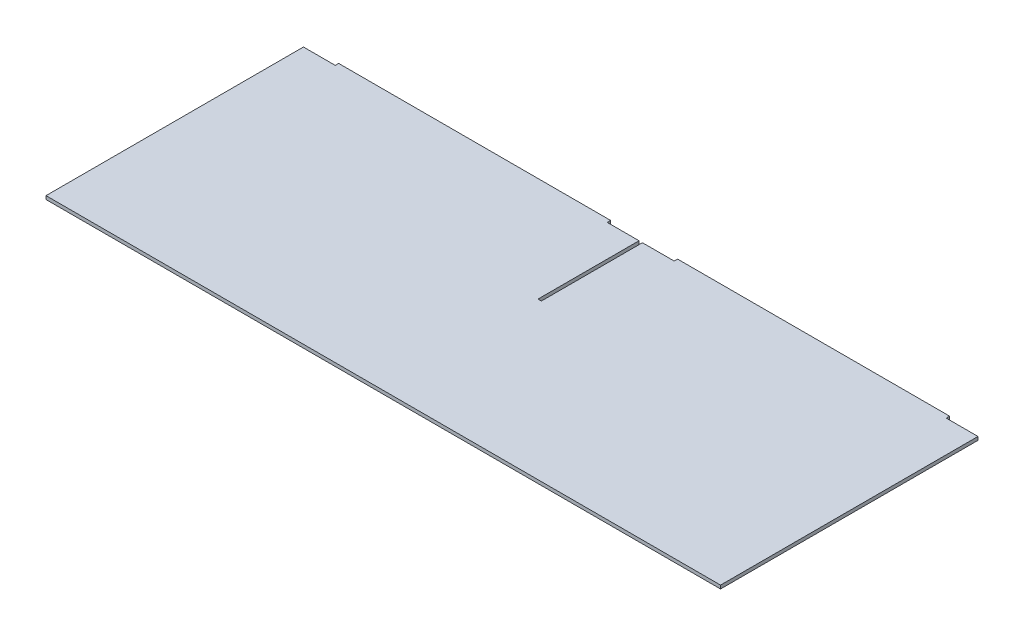
ISO-10303-21;
HEADER;
FILE_DESCRIPTION(('STEP AP214'),'2;1');
FILE_NAME('part.step','',(''),(''),'','','');
FILE_SCHEMA(('AUTOMOTIVE_DESIGN { 1 0 10303 214 1 1 1 1 }'));
ENDSEC;
DATA;
#1=APPLICATION_CONTEXT('core data for automotive mechanical design processes');
#2=APPLICATION_PROTOCOL_DEFINITION('international standard','automotive_design',2000,#1);
#3=PRODUCT_CONTEXT('',#1,'mechanical');
#4=PRODUCT('Part','Part','',(#3));
#5=PRODUCT_RELATED_PRODUCT_CATEGORY('part','',(#4));
#6=PRODUCT_DEFINITION_FORMATION('','',#4);
#7=PRODUCT_DEFINITION_CONTEXT('part definition',#1,'design');
#8=PRODUCT_DEFINITION('design','',#6,#7);
#9=PRODUCT_DEFINITION_SHAPE('','',#8);
#10=(LENGTH_UNIT() NAMED_UNIT(*) SI_UNIT(.MILLI.,.METRE.));
#11=(NAMED_UNIT(*) PLANE_ANGLE_UNIT() SI_UNIT($,.RADIAN.));
#12=(NAMED_UNIT(*) SI_UNIT($,.STERADIAN.) SOLID_ANGLE_UNIT());
#13=UNCERTAINTY_MEASURE_WITH_UNIT(LENGTH_MEASURE(1.E-05),#10,'distance_accuracy_value','');
#14=(GEOMETRIC_REPRESENTATION_CONTEXT(3) GLOBAL_UNCERTAINTY_ASSIGNED_CONTEXT((#13)) GLOBAL_UNIT_ASSIGNED_CONTEXT((#10,
#11,#12)) REPRESENTATION_CONTEXT('',''));
#15=CARTESIAN_POINT('',(0.,0.,0.));
#16=DIRECTION('',(0.,0.,1.));
#17=DIRECTION('',(1.,0.,0.));
#18=AXIS2_PLACEMENT_3D('',#15,#16,#17);
#19=CARTESIAN_POINT('',(0.,3.175,-147.69846));
#20=DIRECTION('',(0.,0.,1.));
#21=DIRECTION('',(1.,0.,0.));
#22=AXIS2_PLACEMENT_3D('',#19,#20,#21);
#23=PLANE('',#22);
#24=DIRECTION('',(-1.,0.,0.));
#25=VECTOR('',#24,1.);
#26=CARTESIAN_POINT('',(0.,0.,-147.69846));
#27=LINE('',#26,#25);
#28=CARTESIAN_POINT('',(346.22613,0.,-147.69846));
#29=VERTEX_POINT('',#28);
#30=CARTESIAN_POINT('',(316.54242,0.,-147.69846));
#31=VERTEX_POINT('',#30);
#32=EDGE_CURVE('E307',#29,#31,#27,.T.);
#33=ORIENTED_EDGE('',*,*,#32,.T.);
#34=DIRECTION('',(0.,1.,0.));
#35=VECTOR('',#34,1.);
#36=CARTESIAN_POINT('',(316.54242,3.175,-147.69846));
#37=LINE('',#36,#35);
#38=CARTESIAN_POINT('',(316.54242,3.175,-147.69846));
#39=VERTEX_POINT('',#38);
#40=EDGE_CURVE('E213',#31,#39,#37,.T.);
#41=ORIENTED_EDGE('',*,*,#40,.T.);
#42=DIRECTION('',(-1.,0.,0.));
#43=VECTOR('',#42,1.);
#44=CARTESIAN_POINT('',(0.,3.175,-147.69846));
#45=LINE('',#44,#43);
#46=CARTESIAN_POINT('',(346.22613,3.17499999999993,-147.69846));
#47=VERTEX_POINT('',#46);
#48=EDGE_CURVE('E299',#47,#39,#45,.T.);
#49=ORIENTED_EDGE('',*,*,#48,.F.);
#50=DIRECTION('',(0.,1.,0.));
#51=VECTOR('',#50,1.);
#52=CARTESIAN_POINT('',(346.22613,0.,-147.69846));
#53=LINE('',#52,#51);
#54=EDGE_CURVE('E259',#29,#47,#53,.T.);
#55=ORIENTED_EDGE('',*,*,#54,.F.);
#56=EDGE_LOOP('',(#33,#41,#49,#55));
#57=FACE_BOUND('',#56,.T.);
#58=ADVANCED_FACE('F39',(#57),#23,.F.);
#59=CARTESIAN_POINT('',(313.36742,3.175,-147.69846));
#60=VERTEX_POINT('',#59);
#61=CARTESIAN_POINT('',(283.68371,3.175,-147.69846));
#62=VERTEX_POINT('',#61);
#63=EDGE_CURVE('E300',#60,#62,#45,.T.);
#64=ORIENTED_EDGE('',*,*,#63,.F.);
#65=DIRECTION('',(0.,-1.,0.));
#66=VECTOR('',#65,1.);
#67=CARTESIAN_POINT('',(313.36742,3.175,-147.69846));
#68=LINE('',#67,#66);
#69=CARTESIAN_POINT('',(313.36742,0.,-147.69846));
#70=VERTEX_POINT('',#69);
#71=EDGE_CURVE('E207',#60,#70,#68,.T.);
#72=ORIENTED_EDGE('',*,*,#71,.T.);
#73=CARTESIAN_POINT('',(283.68371,0.,-147.69846));
#74=VERTEX_POINT('',#73);
#75=EDGE_CURVE('E308',#70,#74,#27,.T.);
#76=ORIENTED_EDGE('',*,*,#75,.T.);
#77=DIRECTION('',(0.,-1.,0.));
#78=VECTOR('',#77,1.);
#79=CARTESIAN_POINT('',(283.68371,0.,-147.69846));
#80=LINE('',#79,#78);
#81=EDGE_CURVE('E217',#62,#74,#80,.T.);
#82=ORIENTED_EDGE('',*,*,#81,.F.);
#83=EDGE_LOOP('',(#64,#72,#76,#82));
#84=FACE_BOUND('',#83,.T.);
#85=ADVANCED_FACE('F336',(#84),#23,.F.);
#86=DIRECTION('',(0.,1.,0.));
#87=VECTOR('',#86,1.);
#88=CARTESIAN_POINT('',(29.6837100000001,0.,-147.69846));
#89=LINE('',#88,#87);
#90=CARTESIAN_POINT('',(29.6837100000001,0.,-147.69846));
#91=VERTEX_POINT('',#90);
#92=CARTESIAN_POINT('',(29.6837100000001,3.175,-147.69846));
#93=VERTEX_POINT('',#92);
#94=EDGE_CURVE('E223',#91,#93,#89,.T.);
#95=ORIENTED_EDGE('',*,*,#94,.F.);
#96=CARTESIAN_POINT('',(0.,0.,-147.69846));
#97=VERTEX_POINT('',#96);
#98=EDGE_CURVE('E304',#91,#97,#27,.T.);
#99=ORIENTED_EDGE('',*,*,#98,.T.);
#100=DIRECTION('',(0.,-1.,0.));
#101=VECTOR('',#100,1.);
#102=CARTESIAN_POINT('',(0.,3.175,-147.69846));
#103=LINE('',#102,#101);
#104=CARTESIAN_POINT('',(0.,3.175,-147.69846));
#105=VERTEX_POINT('',#104);
#106=EDGE_CURVE('E160',#105,#97,#103,.T.);
#107=ORIENTED_EDGE('',*,*,#106,.F.);
#108=EDGE_CURVE('E63',#93,#105,#45,.T.);
#109=ORIENTED_EDGE('',*,*,#108,.F.);
#110=EDGE_LOOP('',(#95,#99,#107,#109));
#111=FACE_BOUND('',#110,.T.);
#112=ADVANCED_FACE('F341',(#111),#23,.F.);
#113=DIRECTION('',(0.,-1.,0.));
#114=VECTOR('',#113,1.);
#115=CARTESIAN_POINT('',(600.22613,0.,-147.69846));
#116=LINE('',#115,#114);
#117=CARTESIAN_POINT('',(600.22613,3.175,-147.69846));
#118=VERTEX_POINT('',#117);
#119=CARTESIAN_POINT('',(600.22613,0.,-147.69846));
#120=VERTEX_POINT('',#119);
#121=EDGE_CURVE('E253',#118,#120,#116,.T.);
#122=ORIENTED_EDGE('',*,*,#121,.F.);
#123=CARTESIAN_POINT('',(629.90984,3.175,-147.69846));
#124=VERTEX_POINT('',#123);
#125=EDGE_CURVE('E296',#124,#118,#45,.T.);
#126=ORIENTED_EDGE('',*,*,#125,.F.);
#127=DIRECTION('',(0.,-1.,0.));
#128=VECTOR('',#127,1.);
#129=CARTESIAN_POINT('',(629.90984,3.175,-147.69846));
#130=LINE('',#129,#128);
#131=CARTESIAN_POINT('',(629.90984,0.,-147.69846));
#132=VERTEX_POINT('',#131);
#133=EDGE_CURVE('E48',#124,#132,#130,.T.);
#134=ORIENTED_EDGE('',*,*,#133,.T.);
#135=EDGE_CURVE('E293',#132,#120,#27,.T.);
#136=ORIENTED_EDGE('',*,*,#135,.T.);
#137=EDGE_LOOP('',(#122,#126,#134,#136));
#138=FACE_BOUND('',#137,.T.);
#139=ADVANCED_FACE('F315',(#138),#23,.F.);
#140=CARTESIAN_POINT('',(0.,3.175,0.));
#141=DIRECTION('',(1.,0.,0.));
#142=DIRECTION('',(0.,0.,-1.));
#143=AXIS2_PLACEMENT_3D('',#140,#141,#142);
#144=PLANE('',#143);
#145=DIRECTION('',(0.,0.,1.));
#146=VECTOR('',#145,1.);
#147=CARTESIAN_POINT('',(0.,0.,0.));
#148=LINE('',#147,#146);
#149=CARTESIAN_POINT('',(0.,0.,92.71));
#150=VERTEX_POINT('',#149);
#151=EDGE_CURVE('E155',#97,#150,#148,.T.);
#152=ORIENTED_EDGE('',*,*,#151,.T.);
#153=DIRECTION('',(0.,1.,0.));
#154=VECTOR('',#153,1.);
#155=CARTESIAN_POINT('',(0.,0.,92.71));
#156=LINE('',#155,#154);
#157=CARTESIAN_POINT('',(0.,3.175,92.71));
#158=VERTEX_POINT('',#157);
#159=EDGE_CURVE('E158',#150,#158,#156,.T.);
#160=ORIENTED_EDGE('',*,*,#159,.T.);
#161=DIRECTION('',(0.,0.,1.));
#162=VECTOR('',#161,1.);
#163=CARTESIAN_POINT('',(0.,3.175,0.));
#164=LINE('',#163,#162);
#165=EDGE_CURVE('E289',#105,#158,#164,.T.);
#166=ORIENTED_EDGE('',*,*,#165,.F.);
#167=ORIENTED_EDGE('',*,*,#106,.T.);
#168=EDGE_LOOP('',(#152,#160,#166,#167));
#169=FACE_BOUND('',#168,.T.);
#170=ADVANCED_FACE('F41',(#169),#144,.F.);
#171=CARTESIAN_POINT('',(629.90984,3.175,0.));
#172=DIRECTION('',(-1.,0.,0.));
#173=DIRECTION('',(0.,0.,1.));
#174=AXIS2_PLACEMENT_3D('',#171,#172,#173);
#175=PLANE('',#174);
#176=DIRECTION('',(0.,0.,-1.));
#177=VECTOR('',#176,1.);
#178=CARTESIAN_POINT('',(629.90984,0.,0.));
#179=LINE('',#178,#177);
#180=CARTESIAN_POINT('',(629.90984,0.,92.71));
#181=VERTEX_POINT('',#180);
#182=EDGE_CURVE('E164',#181,#132,#179,.T.);
#183=ORIENTED_EDGE('',*,*,#182,.T.);
#184=ORIENTED_EDGE('',*,*,#133,.F.);
#185=DIRECTION('',(0.,0.,-1.));
#186=VECTOR('',#185,1.);
#187=CARTESIAN_POINT('',(629.90984,3.175,0.));
#188=LINE('',#187,#186);
#189=CARTESIAN_POINT('',(629.90984,3.175,92.71));
#190=VERTEX_POINT('',#189);
#191=EDGE_CURVE('E292',#190,#124,#188,.T.);
#192=ORIENTED_EDGE('',*,*,#191,.F.);
#193=DIRECTION('',(0.,1.,0.));
#194=VECTOR('',#193,1.);
#195=CARTESIAN_POINT('',(629.90984,0.,92.71));
#196=LINE('',#195,#194);
#197=EDGE_CURVE('E175',#181,#190,#196,.T.);
#198=ORIENTED_EDGE('',*,*,#197,.F.);
#199=EDGE_LOOP('',(#183,#184,#192,#198));
#200=FACE_BOUND('',#199,.T.);
#201=ADVANCED_FACE('F327',(#200),#175,.F.);
#202=CARTESIAN_POINT('',(0.,3.175,0.));
#203=DIRECTION('',(0.,-1.,0.));
#204=DIRECTION('',(0.,0.,-1.));
#205=AXIS2_PLACEMENT_3D('',#202,#203,#204);
#206=PLANE('',#205);
#207=ORIENTED_EDGE('',*,*,#48,.T.);
#208=DIRECTION('',(0.,0.,-1.));
#209=VECTOR('',#208,1.);
#210=CARTESIAN_POINT('',(316.54242,3.175,-53.3320399735148));
#211=LINE('',#210,#209);
#212=CARTESIAN_POINT('',(316.54242,3.175,-53.3320399735148));
#213=VERTEX_POINT('',#212);
#214=EDGE_CURVE('E187',#213,#39,#211,.T.);
#215=ORIENTED_EDGE('',*,*,#214,.F.);
#216=DIRECTION('',(1.,0.,0.));
#217=VECTOR('',#216,1.);
#218=CARTESIAN_POINT('',(313.36742,3.175,-53.3320399735148));
#219=LINE('',#218,#217);
#220=CARTESIAN_POINT('',(313.36742,3.175,-53.3320399735148));
#221=VERTEX_POINT('',#220);
#222=EDGE_CURVE('E192',#221,#213,#219,.T.);
#223=ORIENTED_EDGE('',*,*,#222,.F.);
#224=DIRECTION('',(0.,0.,1.));
#225=VECTOR('',#224,1.);
#226=CARTESIAN_POINT('',(313.36742,3.175,-53.3320399735148));
#227=LINE('',#226,#225);
#228=EDGE_CURVE('E198',#60,#221,#227,.T.);
#229=ORIENTED_EDGE('',*,*,#228,.F.);
#230=ORIENTED_EDGE('',*,*,#63,.T.);
#231=DIRECTION('',(0.,0.,1.));
#232=VECTOR('',#231,1.);
#233=CARTESIAN_POINT('',(283.68371,3.17499999999993,-150.87346));
#234=LINE('',#233,#232);
#235=CARTESIAN_POINT('',(283.68371,3.17499999999993,-150.87346));
#236=VERTEX_POINT('',#235);
#237=EDGE_CURVE('E232',#236,#62,#234,.T.);
#238=ORIENTED_EDGE('',*,*,#237,.F.);
#239=DIRECTION('',(1.,0.,0.));
#240=VECTOR('',#239,1.);
#241=CARTESIAN_POINT('',(283.68371,3.17499999999993,-150.87346));
#242=LINE('',#241,#240);
#243=CARTESIAN_POINT('',(29.6837100000001,3.17499999999993,-150.87346));
#244=VERTEX_POINT('',#243);
#245=EDGE_CURVE('E229',#244,#236,#242,.T.);
#246=ORIENTED_EDGE('',*,*,#245,.F.);
#247=DIRECTION('',(0.,0.,1.));
#248=VECTOR('',#247,1.);
#249=CARTESIAN_POINT('',(29.6837100000001,3.17499999999993,-150.87346));
#250=LINE('',#249,#248);
#251=EDGE_CURVE('E241',#244,#93,#250,.T.);
#252=ORIENTED_EDGE('',*,*,#251,.T.);
#253=ORIENTED_EDGE('',*,*,#108,.T.);
#254=ORIENTED_EDGE('',*,*,#165,.T.);
#255=DIRECTION('',(1.,0.,0.));
#256=VECTOR('',#255,1.);
#257=CARTESIAN_POINT('',(0.,3.175,92.71));
#258=LINE('',#257,#256);
#259=EDGE_CURVE('E173',#158,#190,#258,.T.);
#260=ORIENTED_EDGE('',*,*,#259,.T.);
#261=ORIENTED_EDGE('',*,*,#191,.T.);
#262=ORIENTED_EDGE('',*,*,#125,.T.);
#263=DIRECTION('',(0.,0.,1.));
#264=VECTOR('',#263,1.);
#265=CARTESIAN_POINT('',(600.22613,3.17499999999993,-150.87346));
#266=LINE('',#265,#264);
#267=CARTESIAN_POINT('',(600.22613,3.17499999999993,-150.87346));
#268=VERTEX_POINT('',#267);
#269=EDGE_CURVE('E268',#268,#118,#266,.T.);
#270=ORIENTED_EDGE('',*,*,#269,.F.);
#271=DIRECTION('',(1.,0.,0.));
#272=VECTOR('',#271,1.);
#273=CARTESIAN_POINT('',(600.22613,3.17499999999993,-150.87346));
#274=LINE('',#273,#272);
#275=CARTESIAN_POINT('',(346.22613,3.17499999999993,-150.87346));
#276=VERTEX_POINT('',#275);
#277=EDGE_CURVE('E265',#276,#268,#274,.T.);
#278=ORIENTED_EDGE('',*,*,#277,.F.);
#279=DIRECTION('',(0.,0.,1.));
#280=VECTOR('',#279,1.);
#281=CARTESIAN_POINT('',(346.22613,3.17499999999993,-150.87346));
#282=LINE('',#281,#280);
#283=EDGE_CURVE('E278',#276,#47,#282,.T.);
#284=ORIENTED_EDGE('',*,*,#283,.T.);
#285=EDGE_LOOP('',(#207,#215,#223,#229,#230,#238,#246,#252,#253,#254,#260,#261,#262,#270,#278,#284));
#286=FACE_BOUND('',#285,.T.);
#287=ADVANCED_FACE('F325',(#286),#206,.F.);
#288=CARTESIAN_POINT('',(0.,0.,0.));
#289=DIRECTION('',(0.,-1.,0.));
#290=DIRECTION('',(0.,0.,-1.));
#291=AXIS2_PLACEMENT_3D('',#288,#289,#290);
#292=PLANE('',#291);
#293=DIRECTION('',(0.,0.,-1.));
#294=VECTOR('',#293,1.);
#295=CARTESIAN_POINT('',(316.54242,0.,-53.3320399735148));
#296=LINE('',#295,#294);
#297=CARTESIAN_POINT('',(316.54242,0.,-53.3320399735148));
#298=VERTEX_POINT('',#297);
#299=EDGE_CURVE('E189',#298,#31,#296,.T.);
#300=ORIENTED_EDGE('',*,*,#299,.T.);
#301=ORIENTED_EDGE('',*,*,#32,.F.);
#302=DIRECTION('',(0.,0.,1.));
#303=VECTOR('',#302,1.);
#304=CARTESIAN_POINT('',(346.22613,0.,-150.87346));
#305=LINE('',#304,#303);
#306=CARTESIAN_POINT('',(346.22613,0.,-150.87346));
#307=VERTEX_POINT('',#306);
#308=EDGE_CURVE('E282',#307,#29,#305,.T.);
#309=ORIENTED_EDGE('',*,*,#308,.F.);
#310=DIRECTION('',(-1.,0.,0.));
#311=VECTOR('',#310,1.);
#312=CARTESIAN_POINT('',(600.22613,0.,-150.87346));
#313=LINE('',#312,#311);
#314=CARTESIAN_POINT('',(600.22613,0.,-150.87346));
#315=VERTEX_POINT('',#314);
#316=EDGE_CURVE('E258',#315,#307,#313,.T.);
#317=ORIENTED_EDGE('',*,*,#316,.F.);
#318=DIRECTION('',(0.,0.,1.));
#319=VECTOR('',#318,1.);
#320=CARTESIAN_POINT('',(600.22613,0.,-150.87346));
#321=LINE('',#320,#319);
#322=EDGE_CURVE('E165',#315,#120,#321,.T.);
#323=ORIENTED_EDGE('',*,*,#322,.T.);
#324=ORIENTED_EDGE('',*,*,#135,.F.);
#325=ORIENTED_EDGE('',*,*,#182,.F.);
#326=DIRECTION('',(1.,0.,0.));
#327=VECTOR('',#326,1.);
#328=CARTESIAN_POINT('',(0.,0.,92.71));
#329=LINE('',#328,#327);
#330=EDGE_CURVE('E171',#150,#181,#329,.T.);
#331=ORIENTED_EDGE('',*,*,#330,.F.);
#332=ORIENTED_EDGE('',*,*,#151,.F.);
#333=ORIENTED_EDGE('',*,*,#98,.F.);
#334=DIRECTION('',(0.,0.,1.));
#335=VECTOR('',#334,1.);
#336=CARTESIAN_POINT('',(29.6837100000001,0.,-150.87346));
#337=LINE('',#336,#335);
#338=CARTESIAN_POINT('',(29.6837100000001,0.,-150.87346));
#339=VERTEX_POINT('',#338);
#340=EDGE_CURVE('E245',#339,#91,#337,.T.);
#341=ORIENTED_EDGE('',*,*,#340,.F.);
#342=DIRECTION('',(-1.,0.,0.));
#343=VECTOR('',#342,1.);
#344=CARTESIAN_POINT('',(283.68371,0.,-150.87346));
#345=LINE('',#344,#343);
#346=CARTESIAN_POINT('',(283.68371,0.,-150.87346));
#347=VERTEX_POINT('',#346);
#348=EDGE_CURVE('E222',#347,#339,#345,.T.);
#349=ORIENTED_EDGE('',*,*,#348,.F.);
#350=DIRECTION('',(0.,0.,1.));
#351=VECTOR('',#350,1.);
#352=CARTESIAN_POINT('',(283.68371,0.,-150.87346));
#353=LINE('',#352,#351);
#354=EDGE_CURVE('E249',#347,#74,#353,.T.);
#355=ORIENTED_EDGE('',*,*,#354,.T.);
#356=ORIENTED_EDGE('',*,*,#75,.F.);
#357=DIRECTION('',(0.,0.,-1.));
#358=VECTOR('',#357,1.);
#359=CARTESIAN_POINT('',(313.36742,0.,0.));
#360=LINE('',#359,#358);
#361=CARTESIAN_POINT('',(313.36742,0.,-53.3320399735148));
#362=VERTEX_POINT('',#361);
#363=EDGE_CURVE('E11',#362,#70,#360,.T.);
#364=ORIENTED_EDGE('',*,*,#363,.F.);
#365=DIRECTION('',(1.,0.,0.));
#366=VECTOR('',#365,1.);
#367=CARTESIAN_POINT('',(313.36742,0.,-53.3320399735148));
#368=LINE('',#367,#366);
#369=EDGE_CURVE('E55',#362,#298,#368,.T.);
#370=ORIENTED_EDGE('',*,*,#369,.T.);
#371=EDGE_LOOP('',(#300,#301,#309,#317,#323,#324,#325,#331,#332,#333,#341,#349,#355,#356,#364,#370));
#372=FACE_BOUND('',#371,.T.);
#373=ADVANCED_FACE('F178',(#372),#292,.T.);
#374=CARTESIAN_POINT('',(600.22613,0.,-150.87346));
#375=DIRECTION('',(-1.,0.,0.));
#376=DIRECTION('',(0.,0.,1.));
#377=AXIS2_PLACEMENT_3D('',#374,#375,#376);
#378=PLANE('',#377);
#379=ORIENTED_EDGE('',*,*,#121,.T.);
#380=ORIENTED_EDGE('',*,*,#322,.F.);
#381=DIRECTION('',(0.,-1.,0.));
#382=VECTOR('',#381,1.);
#383=CARTESIAN_POINT('',(600.22613,0.,-150.87346));
#384=LINE('',#383,#382);
#385=EDGE_CURVE('E254',#268,#315,#384,.T.);
#386=ORIENTED_EDGE('',*,*,#385,.F.);
#387=ORIENTED_EDGE('',*,*,#269,.T.);
#388=EDGE_LOOP('',(#379,#380,#386,#387));
#389=FACE_BOUND('',#388,.T.);
#390=ADVANCED_FACE('F321',(#389),#378,.F.);
#391=CARTESIAN_POINT('',(346.22613,0.,-150.87346));
#392=DIRECTION('',(1.,0.,0.));
#393=DIRECTION('',(0.,0.,-1.));
#394=AXIS2_PLACEMENT_3D('',#391,#392,#393);
#395=PLANE('',#394);
#396=ORIENTED_EDGE('',*,*,#54,.T.);
#397=ORIENTED_EDGE('',*,*,#283,.F.);
#398=DIRECTION('',(0.,1.,0.));
#399=VECTOR('',#398,1.);
#400=CARTESIAN_POINT('',(346.22613,0.,-150.87346));
#401=LINE('',#400,#399);
#402=EDGE_CURVE('E262',#307,#276,#401,.T.);
#403=ORIENTED_EDGE('',*,*,#402,.F.);
#404=ORIENTED_EDGE('',*,*,#308,.T.);
#405=EDGE_LOOP('',(#396,#397,#403,#404));
#406=FACE_BOUND('',#405,.T.);
#407=ADVANCED_FACE('F364',(#406),#395,.F.);
#408=CARTESIAN_POINT('',(0.,0.,-150.87346));
#409=DIRECTION('',(0.,0.,1.));
#410=DIRECTION('',(1.,0.,0.));
#411=AXIS2_PLACEMENT_3D('',#408,#409,#410);
#412=PLANE('',#411);
#413=ORIENTED_EDGE('',*,*,#385,.T.);
#414=ORIENTED_EDGE('',*,*,#316,.T.);
#415=ORIENTED_EDGE('',*,*,#402,.T.);
#416=ORIENTED_EDGE('',*,*,#277,.T.);
#417=EDGE_LOOP('',(#413,#414,#415,#416));
#418=FACE_BOUND('',#417,.T.);
#419=ADVANCED_FACE('F367',(#418),#412,.F.);
#420=CARTESIAN_POINT('',(283.68371,0.,-150.87346));
#421=DIRECTION('',(-1.,0.,0.));
#422=DIRECTION('',(0.,0.,1.));
#423=AXIS2_PLACEMENT_3D('',#420,#421,#422);
#424=PLANE('',#423);
#425=ORIENTED_EDGE('',*,*,#81,.T.);
#426=ORIENTED_EDGE('',*,*,#354,.F.);
#427=DIRECTION('',(0.,-1.,0.));
#428=VECTOR('',#427,1.);
#429=CARTESIAN_POINT('',(283.68371,0.,-150.87346));
#430=LINE('',#429,#428);
#431=EDGE_CURVE('E218',#236,#347,#430,.T.);
#432=ORIENTED_EDGE('',*,*,#431,.F.);
#433=ORIENTED_EDGE('',*,*,#237,.T.);
#434=EDGE_LOOP('',(#425,#426,#432,#433));
#435=FACE_BOUND('',#434,.T.);
#436=ADVANCED_FACE('F380',(#435),#424,.F.);
#437=CARTESIAN_POINT('',(29.6837100000001,0.,-150.87346));
#438=DIRECTION('',(1.,0.,0.));
#439=DIRECTION('',(0.,0.,-1.));
#440=AXIS2_PLACEMENT_3D('',#437,#438,#439);
#441=PLANE('',#440);
#442=ORIENTED_EDGE('',*,*,#94,.T.);
#443=ORIENTED_EDGE('',*,*,#251,.F.);
#444=DIRECTION('',(0.,1.,0.));
#445=VECTOR('',#444,1.);
#446=CARTESIAN_POINT('',(29.6837100000001,0.,-150.87346));
#447=LINE('',#446,#445);
#448=EDGE_CURVE('E226',#339,#244,#447,.T.);
#449=ORIENTED_EDGE('',*,*,#448,.F.);
#450=ORIENTED_EDGE('',*,*,#340,.T.);
#451=EDGE_LOOP('',(#442,#443,#449,#450));
#452=FACE_BOUND('',#451,.T.);
#453=ADVANCED_FACE('F356',(#452),#441,.F.);
#454=CARTESIAN_POINT('',(0.,0.,-150.87346));
#455=DIRECTION('',(0.,0.,1.));
#456=DIRECTION('',(1.,0.,0.));
#457=AXIS2_PLACEMENT_3D('',#454,#455,#456);
#458=PLANE('',#457);
#459=ORIENTED_EDGE('',*,*,#431,.T.);
#460=ORIENTED_EDGE('',*,*,#348,.T.);
#461=ORIENTED_EDGE('',*,*,#448,.T.);
#462=ORIENTED_EDGE('',*,*,#245,.T.);
#463=EDGE_LOOP('',(#459,#460,#461,#462));
#464=FACE_BOUND('',#463,.T.);
#465=ADVANCED_FACE('F377',(#464),#458,.F.);
#466=CARTESIAN_POINT('',(316.54242,0.,-53.3320399735148));
#467=DIRECTION('',(1.,0.,0.));
#468=DIRECTION('',(0.,0.,-1.));
#469=AXIS2_PLACEMENT_3D('',#466,#467,#468);
#470=PLANE('',#469);
#471=ORIENTED_EDGE('',*,*,#299,.F.);
#472=DIRECTION('',(0.,1.,0.));
#473=VECTOR('',#472,1.);
#474=CARTESIAN_POINT('',(316.54242,0.,-53.3320399735148));
#475=LINE('',#474,#473);
#476=EDGE_CURVE('E204',#298,#213,#475,.T.);
#477=ORIENTED_EDGE('',*,*,#476,.T.);
#478=ORIENTED_EDGE('',*,*,#214,.T.);
#479=ORIENTED_EDGE('',*,*,#40,.F.);
#480=EDGE_LOOP('',(#471,#477,#478,#479));
#481=FACE_BOUND('',#480,.T.);
#482=ADVANCED_FACE('F390',(#481),#470,.F.);
#483=CARTESIAN_POINT('',(313.36742,0.,-53.3320399735148));
#484=DIRECTION('',(-1.,0.,0.));
#485=DIRECTION('',(0.,0.,1.));
#486=AXIS2_PLACEMENT_3D('',#483,#484,#485);
#487=PLANE('',#486);
#488=ORIENTED_EDGE('',*,*,#228,.T.);
#489=DIRECTION('',(0.,1.,0.));
#490=VECTOR('',#489,1.);
#491=CARTESIAN_POINT('',(313.36742,0.,-53.3320399735148));
#492=LINE('',#491,#490);
#493=EDGE_CURVE('E195',#362,#221,#492,.T.);
#494=ORIENTED_EDGE('',*,*,#493,.F.);
#495=ORIENTED_EDGE('',*,*,#363,.T.);
#496=ORIENTED_EDGE('',*,*,#71,.F.);
#497=EDGE_LOOP('',(#488,#494,#495,#496));
#498=FACE_BOUND('',#497,.T.);
#499=ADVANCED_FACE('F387',(#498),#487,.F.);
#500=CARTESIAN_POINT('',(313.36742,0.,-53.3320399735148));
#501=DIRECTION('',(0.,0.,1.));
#502=DIRECTION('',(1.,0.,0.));
#503=AXIS2_PLACEMENT_3D('',#500,#501,#502);
#504=PLANE('',#503);
#505=ORIENTED_EDGE('',*,*,#222,.T.);
#506=ORIENTED_EDGE('',*,*,#476,.F.);
#507=ORIENTED_EDGE('',*,*,#369,.F.);
#508=ORIENTED_EDGE('',*,*,#493,.T.);
#509=EDGE_LOOP('',(#505,#506,#507,#508));
#510=FACE_BOUND('',#509,.T.);
#511=ADVANCED_FACE('F388',(#510),#504,.F.);
#512=CARTESIAN_POINT('',(0.,0.,92.71));
#513=DIRECTION('',(0.,0.,1.));
#514=DIRECTION('',(1.,0.,0.));
#515=AXIS2_PLACEMENT_3D('',#512,#513,#514);
#516=PLANE('',#515);
#517=ORIENTED_EDGE('',*,*,#259,.F.);
#518=ORIENTED_EDGE('',*,*,#159,.F.);
#519=ORIENTED_EDGE('',*,*,#330,.T.);
#520=ORIENTED_EDGE('',*,*,#197,.T.);
#521=EDGE_LOOP('',(#517,#518,#519,#520));
#522=FACE_BOUND('',#521,.T.);
#523=ADVANCED_FACE('F169',(#522),#516,.T.);
#524=CLOSED_SHELL('',(#58,#85,#112,#139,#170,#201,#287,#373,#390,#407,#419,#436,#453,#465,#482,
#499,#511,#523));
#525=MANIFOLD_SOLID_BREP('B2',#524);
#526=ADVANCED_BREP_SHAPE_REPRESENTATION('',(#18,#525),#14);
#527=SHAPE_DEFINITION_REPRESENTATION(#9,#526);
ENDSEC;
END-ISO-10303-21;
